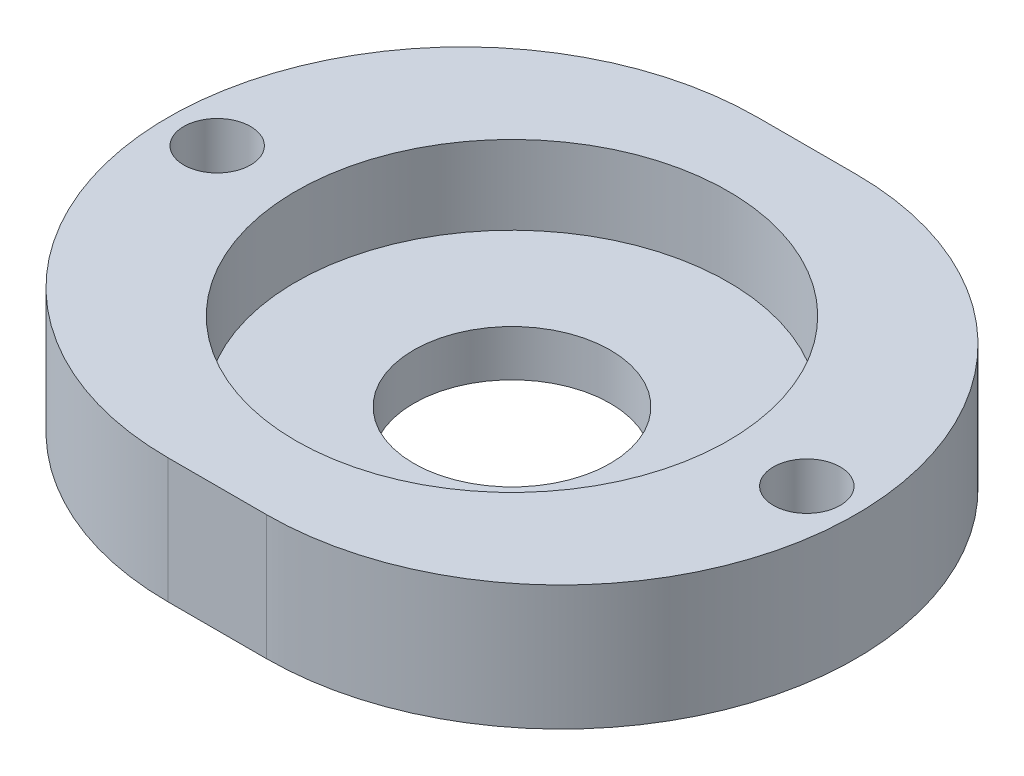
ISO-10303-21;
HEADER;
FILE_DESCRIPTION(('STEP AP214'),'2;1');
FILE_NAME('part.step','',(''),(''),'','','');
FILE_SCHEMA(('AUTOMOTIVE_DESIGN { 1 0 10303 214 1 1 1 1 }'));
ENDSEC;
DATA;
#1=APPLICATION_CONTEXT('core data for automotive mechanical design processes');
#2=APPLICATION_PROTOCOL_DEFINITION('international standard','automotive_design',2000,#1);
#3=PRODUCT_CONTEXT('',#1,'mechanical');
#4=PRODUCT('Part','Part','',(#3));
#5=PRODUCT_RELATED_PRODUCT_CATEGORY('part','',(#4));
#6=PRODUCT_DEFINITION_FORMATION('','',#4);
#7=PRODUCT_DEFINITION_CONTEXT('part definition',#1,'design');
#8=PRODUCT_DEFINITION('design','',#6,#7);
#9=PRODUCT_DEFINITION_SHAPE('','',#8);
#10=(LENGTH_UNIT() NAMED_UNIT(*) SI_UNIT(.MILLI.,.METRE.));
#11=(NAMED_UNIT(*) PLANE_ANGLE_UNIT() SI_UNIT($,.RADIAN.));
#12=(NAMED_UNIT(*) SI_UNIT($,.STERADIAN.) SOLID_ANGLE_UNIT());
#13=UNCERTAINTY_MEASURE_WITH_UNIT(LENGTH_MEASURE(1.E-05),#10,'distance_accuracy_value','');
#14=(GEOMETRIC_REPRESENTATION_CONTEXT(3) GLOBAL_UNCERTAINTY_ASSIGNED_CONTEXT((#13)) GLOBAL_UNIT_ASSIGNED_CONTEXT((#10,
#11,#12)) REPRESENTATION_CONTEXT('',''));
#15=CARTESIAN_POINT('',(0.,0.,0.));
#16=DIRECTION('',(0.,0.,1.));
#17=DIRECTION('',(1.,0.,0.));
#18=AXIS2_PLACEMENT_3D('',#15,#16,#17);
#19=CARTESIAN_POINT('',(2.5,6.35,-15.));
#20=DIRECTION('',(0.,-1.,0.));
#21=DIRECTION('',(0.,0.,-1.));
#22=AXIS2_PLACEMENT_3D('',#19,#20,#21);
#23=CYLINDRICAL_SURFACE('',#22,5.);
#24=CARTESIAN_POINT('',(2.5,0.,-15.));
#25=DIRECTION('',(0.,1.,0.));
#26=DIRECTION('',(0.,0.,1.));
#27=AXIS2_PLACEMENT_3D('',#24,#25,#26);
#28=CIRCLE('',#27,5.);
#29=CARTESIAN_POINT('',(2.5,0.,-10.));
#30=VERTEX_POINT('',#29);
#31=EDGE_CURVE('E102',#30,#30,#28,.T.);
#32=ORIENTED_EDGE('',*,*,#31,.F.);
#33=EDGE_LOOP('',(#32));
#34=FACE_BOUND('',#33,.T.);
#35=CARTESIAN_POINT('',(2.5,2.35,-15.));
#36=DIRECTION('',(0.,1.,0.));
#37=DIRECTION('',(0.,0.,1.));
#38=AXIS2_PLACEMENT_3D('',#35,#36,#37);
#39=CIRCLE('',#38,5.);
#40=CARTESIAN_POINT('',(2.5,2.35,-10.));
#41=VERTEX_POINT('',#40);
#42=EDGE_CURVE('E37',#41,#41,#39,.T.);
#43=ORIENTED_EDGE('',*,*,#42,.T.);
#44=EDGE_LOOP('',(#43));
#45=FACE_BOUND('',#44,.T.);
#46=ADVANCED_FACE('F33',(#34,#45),#23,.F.);
#47=CARTESIAN_POINT('',(0.,6.35,-15.));
#48=DIRECTION('',(0.,1.,0.));
#49=DIRECTION('',(0.,0.,1.));
#50=AXIS2_PLACEMENT_3D('',#47,#48,#49);
#51=PLANE('',#50);
#52=CARTESIAN_POINT('',(-12.5,6.35,-15.));
#53=DIRECTION('',(0.,1.,0.));
#54=DIRECTION('',(0.,0.,1.));
#55=AXIS2_PLACEMENT_3D('',#52,#53,#54);
#56=CIRCLE('',#55,1.69999999999999);
#57=CARTESIAN_POINT('',(-12.5,6.35,-13.3));
#58=VERTEX_POINT('',#57);
#59=EDGE_CURVE('E131',#58,#58,#56,.T.);
#60=ORIENTED_EDGE('',*,*,#59,.F.);
#61=EDGE_LOOP('',(#60));
#62=FACE_BOUND('',#61,.T.);
#63=CARTESIAN_POINT('',(17.5,6.35,-15.));
#64=DIRECTION('',(0.,1.,0.));
#65=DIRECTION('',(0.,0.,1.));
#66=AXIS2_PLACEMENT_3D('',#63,#64,#65);
#67=CIRCLE('',#66,1.69999999999999);
#68=CARTESIAN_POINT('',(17.5,6.35,-13.3));
#69=VERTEX_POINT('',#68);
#70=EDGE_CURVE('E125',#69,#69,#67,.T.);
#71=ORIENTED_EDGE('',*,*,#70,.F.);
#72=EDGE_LOOP('',(#71));
#73=FACE_BOUND('',#72,.T.);
#74=CARTESIAN_POINT('',(2.5,6.35,-15.));
#75=DIRECTION('',(0.,1.,0.));
#76=DIRECTION('',(0.,0.,1.));
#77=AXIS2_PLACEMENT_3D('',#74,#75,#76);
#78=CIRCLE('',#77,11.);
#79=CARTESIAN_POINT('',(2.5,6.35,-4.));
#80=VERTEX_POINT('',#79);
#81=EDGE_CURVE('E116',#80,#80,#78,.T.);
#82=ORIENTED_EDGE('',*,*,#81,.F.);
#83=EDGE_LOOP('',(#82));
#84=FACE_BOUND('',#83,.T.);
#85=CARTESIAN_POINT('',(0.,6.35,-15.));
#86=DIRECTION('',(0.,1.,0.));
#87=DIRECTION('',(0.,0.,1.));
#88=AXIS2_PLACEMENT_3D('',#85,#86,#87);
#89=CIRCLE('',#88,15.);
#90=CARTESIAN_POINT('',(0.,6.35,-30.));
#91=VERTEX_POINT('',#90);
#92=CARTESIAN_POINT('',(0.,6.35,0.));
#93=VERTEX_POINT('',#92);
#94=EDGE_CURVE('E86',#91,#93,#89,.T.);
#95=ORIENTED_EDGE('',*,*,#94,.T.);
#96=DIRECTION('',(1.,0.,0.));
#97=VECTOR('',#96,1.);
#98=CARTESIAN_POINT('',(0.,6.35,0.));
#99=LINE('',#98,#97);
#100=CARTESIAN_POINT('',(5.,6.35,0.));
#101=VERTEX_POINT('',#100);
#102=EDGE_CURVE('E81',#93,#101,#99,.T.);
#103=ORIENTED_EDGE('',*,*,#102,.T.);
#104=CARTESIAN_POINT('',(5.,6.35,-15.));
#105=DIRECTION('',(0.,1.,0.));
#106=DIRECTION('',(0.,0.,1.));
#107=AXIS2_PLACEMENT_3D('',#104,#105,#106);
#108=CIRCLE('',#107,15.);
#109=CARTESIAN_POINT('',(5.,6.35,-30.));
#110=VERTEX_POINT('',#109);
#111=EDGE_CURVE('E84',#101,#110,#108,.T.);
#112=ORIENTED_EDGE('',*,*,#111,.T.);
#113=DIRECTION('',(-1.,0.,0.));
#114=VECTOR('',#113,1.);
#115=CARTESIAN_POINT('',(0.,6.35,-30.));
#116=LINE('',#115,#114);
#117=EDGE_CURVE('E51',#110,#91,#116,.T.);
#118=ORIENTED_EDGE('',*,*,#117,.T.);
#119=EDGE_LOOP('',(#95,#103,#112,#118));
#120=FACE_BOUND('',#119,.T.);
#121=ADVANCED_FACE('F82',(#62,#73,#84,#120),#51,.T.);
#122=CARTESIAN_POINT('',(0.,0.,-15.));
#123=DIRECTION('',(0.,1.,0.));
#124=DIRECTION('',(0.,0.,1.));
#125=AXIS2_PLACEMENT_3D('',#122,#123,#124);
#126=PLANE('',#125);
#127=CARTESIAN_POINT('',(-12.5,0.,-15.));
#128=DIRECTION('',(0.,1.,0.));
#129=DIRECTION('',(0.,0.,1.));
#130=AXIS2_PLACEMENT_3D('',#127,#128,#129);
#131=CIRCLE('',#130,1.7);
#132=CARTESIAN_POINT('',(-12.5,0.,-13.3));
#133=VERTEX_POINT('',#132);
#134=EDGE_CURVE('E128',#133,#133,#131,.T.);
#135=ORIENTED_EDGE('',*,*,#134,.T.);
#136=EDGE_LOOP('',(#135));
#137=FACE_BOUND('',#136,.T.);
#138=CARTESIAN_POINT('',(17.5,0.,-15.));
#139=DIRECTION('',(0.,1.,0.));
#140=DIRECTION('',(0.,0.,1.));
#141=AXIS2_PLACEMENT_3D('',#138,#139,#140);
#142=CIRCLE('',#141,1.7);
#143=CARTESIAN_POINT('',(17.5,0.,-13.3));
#144=VERTEX_POINT('',#143);
#145=EDGE_CURVE('E120',#144,#144,#142,.T.);
#146=ORIENTED_EDGE('',*,*,#145,.T.);
#147=EDGE_LOOP('',(#146));
#148=FACE_BOUND('',#147,.T.);
#149=CARTESIAN_POINT('',(0.,0.,-15.));
#150=DIRECTION('',(0.,1.,0.));
#151=DIRECTION('',(0.,0.,1.));
#152=AXIS2_PLACEMENT_3D('',#149,#150,#151);
#153=CIRCLE('',#152,15.);
#154=CARTESIAN_POINT('',(0.,0.,-30.));
#155=VERTEX_POINT('',#154);
#156=CARTESIAN_POINT('',(0.,0.,0.));
#157=VERTEX_POINT('',#156);
#158=EDGE_CURVE('E99',#155,#157,#153,.T.);
#159=ORIENTED_EDGE('',*,*,#158,.F.);
#160=DIRECTION('',(-1.,0.,0.));
#161=VECTOR('',#160,1.);
#162=CARTESIAN_POINT('',(0.,0.,-30.));
#163=LINE('',#162,#161);
#164=CARTESIAN_POINT('',(5.,0.,-30.));
#165=VERTEX_POINT('',#164);
#166=EDGE_CURVE('E74',#165,#155,#163,.T.);
#167=ORIENTED_EDGE('',*,*,#166,.F.);
#168=CARTESIAN_POINT('',(5.,0.,-15.));
#169=DIRECTION('',(0.,1.,0.));
#170=DIRECTION('',(0.,0.,1.));
#171=AXIS2_PLACEMENT_3D('',#168,#169,#170);
#172=CIRCLE('',#171,15.);
#173=CARTESIAN_POINT('',(5.,0.,0.));
#174=VERTEX_POINT('',#173);
#175=EDGE_CURVE('E68',#174,#165,#172,.T.);
#176=ORIENTED_EDGE('',*,*,#175,.F.);
#177=DIRECTION('',(1.,0.,0.));
#178=VECTOR('',#177,1.);
#179=CARTESIAN_POINT('',(0.,0.,0.));
#180=LINE('',#179,#178);
#181=EDGE_CURVE('E90',#157,#174,#180,.T.);
#182=ORIENTED_EDGE('',*,*,#181,.F.);
#183=EDGE_LOOP('',(#159,#167,#176,#182));
#184=FACE_BOUND('',#183,.T.);
#185=ORIENTED_EDGE('',*,*,#31,.T.);
#186=EDGE_LOOP('',(#185));
#187=FACE_BOUND('',#186,.T.);
#188=ADVANCED_FACE('F110',(#137,#148,#184,#187),#126,.F.);
#189=CARTESIAN_POINT('',(0.,6.35,-15.));
#190=DIRECTION('',(0.,-1.,0.));
#191=DIRECTION('',(0.,0.,-1.));
#192=AXIS2_PLACEMENT_3D('',#189,#190,#191);
#193=CYLINDRICAL_SURFACE('',#192,15.);
#194=ORIENTED_EDGE('',*,*,#158,.T.);
#195=DIRECTION('',(0.,-1.,0.));
#196=VECTOR('',#195,1.);
#197=CARTESIAN_POINT('',(0.,6.35,0.));
#198=LINE('',#197,#196);
#199=EDGE_CURVE('E11',#93,#157,#198,.T.);
#200=ORIENTED_EDGE('',*,*,#199,.F.);
#201=ORIENTED_EDGE('',*,*,#94,.F.);
#202=DIRECTION('',(0.,-1.,0.));
#203=VECTOR('',#202,1.);
#204=CARTESIAN_POINT('',(0.,6.35,-30.));
#205=LINE('',#204,#203);
#206=EDGE_CURVE('E95',#91,#155,#205,.T.);
#207=ORIENTED_EDGE('',*,*,#206,.T.);
#208=EDGE_LOOP('',(#194,#200,#201,#207));
#209=FACE_BOUND('',#208,.T.);
#210=ADVANCED_FACE('F35',(#209),#193,.T.);
#211=CARTESIAN_POINT('',(0.,6.35,0.));
#212=DIRECTION('',(0.,0.,-1.));
#213=DIRECTION('',(-1.,0.,0.));
#214=AXIS2_PLACEMENT_3D('',#211,#212,#213);
#215=PLANE('',#214);
#216=ORIENTED_EDGE('',*,*,#181,.T.);
#217=DIRECTION('',(0.,-1.,0.));
#218=VECTOR('',#217,1.);
#219=CARTESIAN_POINT('',(5.,6.35,0.));
#220=LINE('',#219,#218);
#221=EDGE_CURVE('E43',#101,#174,#220,.T.);
#222=ORIENTED_EDGE('',*,*,#221,.F.);
#223=ORIENTED_EDGE('',*,*,#102,.F.);
#224=ORIENTED_EDGE('',*,*,#199,.T.);
#225=EDGE_LOOP('',(#216,#222,#223,#224));
#226=FACE_BOUND('',#225,.T.);
#227=ADVANCED_FACE('F89',(#226),#215,.F.);
#228=CARTESIAN_POINT('',(5.,6.35,-15.));
#229=DIRECTION('',(0.,-1.,0.));
#230=DIRECTION('',(0.,0.,-1.));
#231=AXIS2_PLACEMENT_3D('',#228,#229,#230);
#232=CYLINDRICAL_SURFACE('',#231,15.);
#233=ORIENTED_EDGE('',*,*,#175,.T.);
#234=DIRECTION('',(0.,-1.,0.));
#235=VECTOR('',#234,1.);
#236=CARTESIAN_POINT('',(5.,6.35,-30.));
#237=LINE('',#236,#235);
#238=EDGE_CURVE('E91',#110,#165,#237,.T.);
#239=ORIENTED_EDGE('',*,*,#238,.F.);
#240=ORIENTED_EDGE('',*,*,#111,.F.);
#241=ORIENTED_EDGE('',*,*,#221,.T.);
#242=EDGE_LOOP('',(#233,#239,#240,#241));
#243=FACE_BOUND('',#242,.T.);
#244=ADVANCED_FACE('F93',(#243),#232,.T.);
#245=CARTESIAN_POINT('',(0.,6.35,-30.));
#246=DIRECTION('',(0.,0.,1.));
#247=DIRECTION('',(1.,0.,0.));
#248=AXIS2_PLACEMENT_3D('',#245,#246,#247);
#249=PLANE('',#248);
#250=ORIENTED_EDGE('',*,*,#166,.T.);
#251=ORIENTED_EDGE('',*,*,#206,.F.);
#252=ORIENTED_EDGE('',*,*,#117,.F.);
#253=ORIENTED_EDGE('',*,*,#238,.T.);
#254=EDGE_LOOP('',(#250,#251,#252,#253));
#255=FACE_BOUND('',#254,.T.);
#256=ADVANCED_FACE('F107',(#255),#249,.F.);
#257=CARTESIAN_POINT('',(2.5,2.35,-15.));
#258=DIRECTION('',(0.,1.,0.));
#259=DIRECTION('',(0.,0.,1.));
#260=AXIS2_PLACEMENT_3D('',#257,#258,#259);
#261=CYLINDRICAL_SURFACE('',#260,11.);
#262=CARTESIAN_POINT('',(2.5,2.35,-15.));
#263=DIRECTION('',(0.,1.,0.));
#264=DIRECTION('',(0.,0.,1.));
#265=AXIS2_PLACEMENT_3D('',#262,#263,#264);
#266=CIRCLE('',#265,11.);
#267=CARTESIAN_POINT('',(2.5,2.35,-4.));
#268=VERTEX_POINT('',#267);
#269=EDGE_CURVE('E119',#268,#268,#266,.T.);
#270=ORIENTED_EDGE('',*,*,#269,.F.);
#271=EDGE_LOOP('',(#270));
#272=FACE_BOUND('',#271,.T.);
#273=ORIENTED_EDGE('',*,*,#81,.T.);
#274=EDGE_LOOP('',(#273));
#275=FACE_BOUND('',#274,.T.);
#276=ADVANCED_FACE('F144',(#272,#275),#261,.F.);
#277=CARTESIAN_POINT('',(2.5,2.35,-15.));
#278=DIRECTION('',(0.,1.,0.));
#279=DIRECTION('',(0.,0.,1.));
#280=AXIS2_PLACEMENT_3D('',#277,#278,#279);
#281=PLANE('',#280);
#282=ORIENTED_EDGE('',*,*,#42,.F.);
#283=EDGE_LOOP('',(#282));
#284=FACE_BOUND('',#283,.T.);
#285=ORIENTED_EDGE('',*,*,#269,.T.);
#286=EDGE_LOOP('',(#285));
#287=FACE_BOUND('',#286,.T.);
#288=ADVANCED_FACE('F146',(#284,#287),#281,.T.);
#289=CARTESIAN_POINT('',(17.5,6.35,-15.));
#290=DIRECTION('',(0.,1.,0.));
#291=DIRECTION('',(0.,0.,1.));
#292=AXIS2_PLACEMENT_3D('',#289,#290,#291);
#293=CYLINDRICAL_SURFACE('',#292,1.69999999999999);
#294=ORIENTED_EDGE('',*,*,#145,.F.);
#295=EDGE_LOOP('',(#294));
#296=FACE_BOUND('',#295,.T.);
#297=ORIENTED_EDGE('',*,*,#70,.T.);
#298=EDGE_LOOP('',(#297));
#299=FACE_BOUND('',#298,.T.);
#300=ADVANCED_FACE('F153',(#296,#299),#293,.F.);
#301=CARTESIAN_POINT('',(-12.5,6.35,-15.));
#302=DIRECTION('',(0.,1.,0.));
#303=DIRECTION('',(0.,0.,1.));
#304=AXIS2_PLACEMENT_3D('',#301,#302,#303);
#305=CYLINDRICAL_SURFACE('',#304,1.69999999999999);
#306=ORIENTED_EDGE('',*,*,#134,.F.);
#307=EDGE_LOOP('',(#306));
#308=FACE_BOUND('',#307,.T.);
#309=ORIENTED_EDGE('',*,*,#59,.T.);
#310=EDGE_LOOP('',(#309));
#311=FACE_BOUND('',#310,.T.);
#312=ADVANCED_FACE('F135',(#308,#311),#305,.F.);
#313=CLOSED_SHELL('',(#46,#121,#188,#210,#227,#244,#256,#276,#288,#300,#312));
#314=MANIFOLD_SOLID_BREP('B2',#313);
#315=ADVANCED_BREP_SHAPE_REPRESENTATION('',(#18,#314),#14);
#316=SHAPE_DEFINITION_REPRESENTATION(#9,#315);
ENDSEC;
END-ISO-10303-21;
